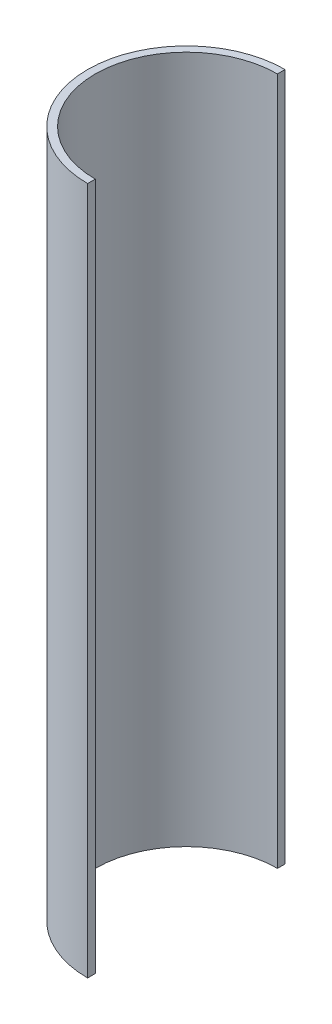
ISO-10303-21;
HEADER;
FILE_DESCRIPTION(('STEP AP214'),'2;1');
FILE_NAME('part.step','',(''),(''),'','','');
FILE_SCHEMA(('AUTOMOTIVE_DESIGN { 1 0 10303 214 1 1 1 1 }'));
ENDSEC;
DATA;
#1=APPLICATION_CONTEXT('core data for automotive mechanical design processes');
#2=APPLICATION_PROTOCOL_DEFINITION('international standard','automotive_design',2000,#1);
#3=PRODUCT_CONTEXT('',#1,'mechanical');
#4=PRODUCT('Part','Part','',(#3));
#5=PRODUCT_RELATED_PRODUCT_CATEGORY('part','',(#4));
#6=PRODUCT_DEFINITION_FORMATION('','',#4);
#7=PRODUCT_DEFINITION_CONTEXT('part definition',#1,'design');
#8=PRODUCT_DEFINITION('design','',#6,#7);
#9=PRODUCT_DEFINITION_SHAPE('','',#8);
#10=(LENGTH_UNIT() NAMED_UNIT(*) SI_UNIT(.MILLI.,.METRE.));
#11=(NAMED_UNIT(*) PLANE_ANGLE_UNIT() SI_UNIT($,.RADIAN.));
#12=(NAMED_UNIT(*) SI_UNIT($,.STERADIAN.) SOLID_ANGLE_UNIT());
#13=UNCERTAINTY_MEASURE_WITH_UNIT(LENGTH_MEASURE(1.E-05),#10,'distance_accuracy_value','');
#14=(GEOMETRIC_REPRESENTATION_CONTEXT(3) GLOBAL_UNCERTAINTY_ASSIGNED_CONTEXT((#13)) GLOBAL_UNIT_ASSIGNED_CONTEXT((#10,
#11,#12)) REPRESENTATION_CONTEXT('',''));
#15=CARTESIAN_POINT('',(0.,0.,0.));
#16=DIRECTION('',(0.,0.,1.));
#17=DIRECTION('',(1.,0.,0.));
#18=AXIS2_PLACEMENT_3D('',#15,#16,#17);
#19=CARTESIAN_POINT('',(0.,270.,0.));
#20=DIRECTION('',(0.,-1.,0.));
#21=DIRECTION('',(0.,0.,-1.));
#22=AXIS2_PLACEMENT_3D('',#19,#20,#21);
#23=CYLINDRICAL_SURFACE('',#22,38.75);
#24=CARTESIAN_POINT('',(0.,270.,0.));
#25=DIRECTION('',(0.,1.,0.));
#26=DIRECTION('',(0.,0.,1.));
#27=AXIS2_PLACEMENT_3D('',#24,#25,#26);
#28=CIRCLE('',#27,38.75);
#29=CARTESIAN_POINT('',(0.,270.,-38.75));
#30=VERTEX_POINT('',#29);
#31=CARTESIAN_POINT('',(0.,270.,38.75));
#32=VERTEX_POINT('',#31);
#33=EDGE_CURVE('E47',#30,#32,#28,.T.);
#34=ORIENTED_EDGE('',*,*,#33,.F.);
#35=DIRECTION('',(0.,1.,0.));
#36=VECTOR('',#35,1.);
#37=CARTESIAN_POINT('',(0.,-210.,-38.75));
#38=LINE('',#37,#36);
#39=CARTESIAN_POINT('',(0.,0.,-38.75));
#40=VERTEX_POINT('',#39);
#41=EDGE_CURVE('E96',#40,#30,#38,.T.);
#42=ORIENTED_EDGE('',*,*,#41,.F.);
#43=CARTESIAN_POINT('',(0.,0.,0.));
#44=DIRECTION('',(0.,1.,0.));
#45=DIRECTION('',(0.,0.,1.));
#46=AXIS2_PLACEMENT_3D('',#43,#44,#45);
#47=CIRCLE('',#46,38.75);
#48=CARTESIAN_POINT('',(0.,0.,38.75));
#49=VERTEX_POINT('',#48);
#50=EDGE_CURVE('E94',#40,#49,#47,.T.);
#51=ORIENTED_EDGE('',*,*,#50,.T.);
#52=DIRECTION('',(0.,1.,0.));
#53=VECTOR('',#52,1.);
#54=CARTESIAN_POINT('',(0.,-210.,38.75));
#55=LINE('',#54,#53);
#56=EDGE_CURVE('E81',#49,#32,#55,.T.);
#57=ORIENTED_EDGE('',*,*,#56,.T.);
#58=EDGE_LOOP('',(#34,#42,#51,#57));
#59=FACE_BOUND('',#58,.T.);
#60=ADVANCED_FACE('F39',(#59),#23,.T.);
#61=CARTESIAN_POINT('',(0.,270.,0.));
#62=DIRECTION('',(0.,1.,0.));
#63=DIRECTION('',(0.,0.,1.));
#64=AXIS2_PLACEMENT_3D('',#61,#62,#63);
#65=PLANE('',#64);
#66=DIRECTION('',(0.,0.,1.));
#67=VECTOR('',#66,1.);
#68=CARTESIAN_POINT('',(0.,270.,-38.75));
#69=LINE('',#68,#67);
#70=CARTESIAN_POINT('',(0.,270.,-35.75));
#71=VERTEX_POINT('',#70);
#72=EDGE_CURVE('E62',#30,#71,#69,.T.);
#73=ORIENTED_EDGE('',*,*,#72,.F.);
#74=ORIENTED_EDGE('',*,*,#33,.T.);
#75=CARTESIAN_POINT('',(0.,270.,35.75));
#76=VERTEX_POINT('',#75);
#77=EDGE_CURVE('E78',#76,#32,#69,.T.);
#78=ORIENTED_EDGE('',*,*,#77,.F.);
#79=CARTESIAN_POINT('',(0.,270.,0.));
#80=DIRECTION('',(0.,1.,0.));
#81=DIRECTION('',(0.,0.,-1.));
#82=AXIS2_PLACEMENT_3D('',#79,#80,#81);
#83=CIRCLE('',#82,35.75);
#84=EDGE_CURVE('E106',#71,#76,#83,.T.);
#85=ORIENTED_EDGE('',*,*,#84,.F.);
#86=EDGE_LOOP('',(#73,#74,#78,#85));
#87=FACE_BOUND('',#86,.T.);
#88=ADVANCED_FACE('F98',(#87),#65,.T.);
#89=CARTESIAN_POINT('',(0.,0.,0.));
#90=DIRECTION('',(0.,1.,0.));
#91=DIRECTION('',(0.,0.,1.));
#92=AXIS2_PLACEMENT_3D('',#89,#90,#91);
#93=PLANE('',#92);
#94=ORIENTED_EDGE('',*,*,#50,.F.);
#95=DIRECTION('',(0.,0.,1.));
#96=VECTOR('',#95,1.);
#97=CARTESIAN_POINT('',(0.,0.,0.));
#98=LINE('',#97,#96);
#99=CARTESIAN_POINT('',(0.,0.,-35.75));
#100=VERTEX_POINT('',#99);
#101=EDGE_CURVE('E111',#40,#100,#98,.T.);
#102=ORIENTED_EDGE('',*,*,#101,.T.);
#103=CARTESIAN_POINT('',(0.,0.,0.));
#104=DIRECTION('',(0.,1.,0.));
#105=DIRECTION('',(0.,0.,1.));
#106=AXIS2_PLACEMENT_3D('',#103,#104,#105);
#107=CIRCLE('',#106,35.75);
#108=CARTESIAN_POINT('',(0.,0.,35.75));
#109=VERTEX_POINT('',#108);
#110=EDGE_CURVE('E11',#100,#109,#107,.T.);
#111=ORIENTED_EDGE('',*,*,#110,.T.);
#112=EDGE_CURVE('E54',#109,#49,#98,.T.);
#113=ORIENTED_EDGE('',*,*,#112,.T.);
#114=EDGE_LOOP('',(#94,#102,#111,#113));
#115=FACE_BOUND('',#114,.T.);
#116=ADVANCED_FACE('F119',(#115),#93,.F.);
#117=CARTESIAN_POINT('',(0.,-210.,0.));
#118=DIRECTION('',(0.,1.,0.));
#119=DIRECTION('',(0.,0.,1.));
#120=AXIS2_PLACEMENT_3D('',#117,#118,#119);
#121=CYLINDRICAL_SURFACE('',#120,35.75);
#122=DIRECTION('',(0.,1.,0.));
#123=VECTOR('',#122,1.);
#124=CARTESIAN_POINT('',(0.,-210.,-35.75));
#125=LINE('',#124,#123);
#126=EDGE_CURVE('E102',#100,#71,#125,.T.);
#127=ORIENTED_EDGE('',*,*,#126,.T.);
#128=ORIENTED_EDGE('',*,*,#84,.T.);
#129=DIRECTION('',(0.,1.,0.));
#130=VECTOR('',#129,1.);
#131=CARTESIAN_POINT('',(0.,-210.,35.75));
#132=LINE('',#131,#130);
#133=EDGE_CURVE('E82',#109,#76,#132,.T.);
#134=ORIENTED_EDGE('',*,*,#133,.F.);
#135=ORIENTED_EDGE('',*,*,#110,.F.);
#136=EDGE_LOOP('',(#127,#128,#134,#135));
#137=FACE_BOUND('',#136,.T.);
#138=ADVANCED_FACE('F122',(#137),#121,.F.);
#139=CARTESIAN_POINT('',(0.,-210.,-38.75));
#140=DIRECTION('',(-1.,0.,0.));
#141=DIRECTION('',(0.,0.,1.));
#142=AXIS2_PLACEMENT_3D('',#139,#140,#141);
#143=PLANE('',#142);
#144=ORIENTED_EDGE('',*,*,#41,.T.);
#145=ORIENTED_EDGE('',*,*,#72,.T.);
#146=ORIENTED_EDGE('',*,*,#126,.F.);
#147=ORIENTED_EDGE('',*,*,#101,.F.);
#148=EDGE_LOOP('',(#144,#145,#146,#147));
#149=FACE_BOUND('',#148,.T.);
#150=ADVANCED_FACE('F123',(#149),#143,.F.);
#151=ORIENTED_EDGE('',*,*,#133,.T.);
#152=ORIENTED_EDGE('',*,*,#77,.T.);
#153=ORIENTED_EDGE('',*,*,#56,.F.);
#154=ORIENTED_EDGE('',*,*,#112,.F.);
#155=EDGE_LOOP('',(#151,#152,#153,#154));
#156=FACE_BOUND('',#155,.T.);
#157=ADVANCED_FACE('F80',(#156),#143,.F.);
#158=CLOSED_SHELL('',(#60,#88,#116,#138,#150,#157));
#159=MANIFOLD_SOLID_BREP('B2',#158);
#160=ADVANCED_BREP_SHAPE_REPRESENTATION('',(#18,#159),#14);
#161=SHAPE_DEFINITION_REPRESENTATION(#9,#160);
ENDSEC;
END-ISO-10303-21;
